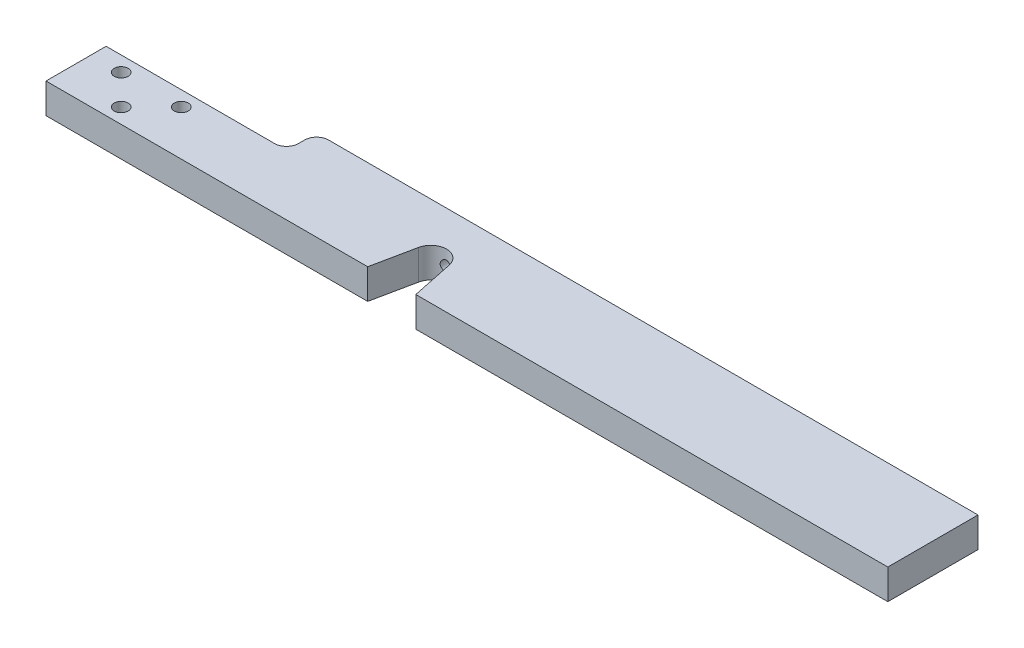
ISO-10303-21;
HEADER;
FILE_DESCRIPTION(('STEP AP214'),'2;1');
FILE_NAME('part.step','',(''),(''),'','','');
FILE_SCHEMA(('AUTOMOTIVE_DESIGN { 1 0 10303 214 1 1 1 1 }'));
ENDSEC;
DATA;
#1=APPLICATION_CONTEXT('core data for automotive mechanical design processes');
#2=APPLICATION_PROTOCOL_DEFINITION('international standard','automotive_design',2000,#1);
#3=PRODUCT_CONTEXT('',#1,'mechanical');
#4=PRODUCT('Part','Part','',(#3));
#5=PRODUCT_RELATED_PRODUCT_CATEGORY('part','',(#4));
#6=PRODUCT_DEFINITION_FORMATION('','',#4);
#7=PRODUCT_DEFINITION_CONTEXT('part definition',#1,'design');
#8=PRODUCT_DEFINITION('design','',#6,#7);
#9=PRODUCT_DEFINITION_SHAPE('','',#8);
#10=(LENGTH_UNIT() NAMED_UNIT(*) SI_UNIT(.MILLI.,.METRE.));
#11=(NAMED_UNIT(*) PLANE_ANGLE_UNIT() SI_UNIT($,.RADIAN.));
#12=(NAMED_UNIT(*) SI_UNIT($,.STERADIAN.) SOLID_ANGLE_UNIT());
#13=UNCERTAINTY_MEASURE_WITH_UNIT(LENGTH_MEASURE(1.E-05),#10,'distance_accuracy_value','');
#14=(GEOMETRIC_REPRESENTATION_CONTEXT(3) GLOBAL_UNCERTAINTY_ASSIGNED_CONTEXT((#13)) GLOBAL_UNIT_ASSIGNED_CONTEXT((#10,
#11,#12)) REPRESENTATION_CONTEXT('',''));
#15=CARTESIAN_POINT('',(0.,0.,0.));
#16=DIRECTION('',(0.,0.,1.));
#17=DIRECTION('',(1.,0.,0.));
#18=AXIS2_PLACEMENT_3D('',#15,#16,#17);
#19=CARTESIAN_POINT('',(0.,6.35,0.));
#20=DIRECTION('',(1.,0.,0.));
#21=DIRECTION('',(0.,0.,-1.));
#22=AXIS2_PLACEMENT_3D('',#19,#20,#21);
#23=PLANE('',#22);
#24=DIRECTION('',(0.,0.,1.));
#25=VECTOR('',#24,1.);
#26=CARTESIAN_POINT('',(0.,0.,0.));
#27=LINE('',#26,#25);
#28=CARTESIAN_POINT('',(0.,0.,-12.7));
#29=VERTEX_POINT('',#28);
#30=CARTESIAN_POINT('',(0.,0.,0.));
#31=VERTEX_POINT('',#30);
#32=EDGE_CURVE('E168',#29,#31,#27,.T.);
#33=ORIENTED_EDGE('',*,*,#32,.T.);
#34=DIRECTION('',(0.,-1.,0.));
#35=VECTOR('',#34,1.);
#36=CARTESIAN_POINT('',(0.,6.35,0.));
#37=LINE('',#36,#35);
#38=CARTESIAN_POINT('',(0.,6.35,0.));
#39=VERTEX_POINT('',#38);
#40=EDGE_CURVE('E11',#39,#31,#37,.T.);
#41=ORIENTED_EDGE('',*,*,#40,.F.);
#42=DIRECTION('',(0.,0.,1.));
#43=VECTOR('',#42,1.);
#44=CARTESIAN_POINT('',(0.,6.35,0.));
#45=LINE('',#44,#43);
#46=CARTESIAN_POINT('',(0.,6.35,-12.7));
#47=VERTEX_POINT('',#46);
#48=EDGE_CURVE('E203',#47,#39,#45,.T.);
#49=ORIENTED_EDGE('',*,*,#48,.F.);
#50=DIRECTION('',(0.,-1.,0.));
#51=VECTOR('',#50,1.);
#52=CARTESIAN_POINT('',(0.,6.35,-12.7));
#53=LINE('',#52,#51);
#54=EDGE_CURVE('E164',#47,#29,#53,.T.);
#55=ORIENTED_EDGE('',*,*,#54,.T.);
#56=EDGE_LOOP('',(#33,#41,#49,#55));
#57=FACE_BOUND('',#56,.T.);
#58=ADVANCED_FACE('F41',(#57),#23,.F.);
#59=CARTESIAN_POINT('',(0.,6.35,0.));
#60=DIRECTION('',(0.,0.,-1.));
#61=DIRECTION('',(-1.,0.,0.));
#62=AXIS2_PLACEMENT_3D('',#59,#60,#61);
#63=PLANE('',#62);
#64=DIRECTION('',(1.,0.,0.));
#65=VECTOR('',#64,1.);
#66=CARTESIAN_POINT('',(0.,0.,0.));
#67=LINE('',#66,#65);
#68=CARTESIAN_POINT('',(67.945,0.,0.));
#69=VERTEX_POINT('',#68);
#70=EDGE_CURVE('E172',#31,#69,#67,.T.);
#71=ORIENTED_EDGE('',*,*,#70,.T.);
#72=DIRECTION('',(0.,-1.,0.));
#73=VECTOR('',#72,1.);
#74=CARTESIAN_POINT('',(67.945,6.35,0.));
#75=LINE('',#74,#73);
#76=CARTESIAN_POINT('',(67.945,6.35,0.));
#77=VERTEX_POINT('',#76);
#78=EDGE_CURVE('E51',#77,#69,#75,.T.);
#79=ORIENTED_EDGE('',*,*,#78,.F.);
#80=DIRECTION('',(1.,0.,0.));
#81=VECTOR('',#80,1.);
#82=CARTESIAN_POINT('',(0.,6.35,0.));
#83=LINE('',#82,#81);
#84=EDGE_CURVE('E115',#39,#77,#83,.T.);
#85=ORIENTED_EDGE('',*,*,#84,.F.);
#86=ORIENTED_EDGE('',*,*,#40,.T.);
#87=EDGE_LOOP('',(#71,#79,#85,#86));
#88=FACE_BOUND('',#87,.T.);
#89=ADVANCED_FACE('F311',(#88),#63,.F.);
#90=CARTESIAN_POINT('',(67.945,6.35,0.));
#91=DIRECTION('',(-0.979257447594277,0.,-0.202619967750324));
#92=DIRECTION('',(-0.202619967750324,0.,0.979257447594277));
#93=AXIS2_PLACEMENT_3D('',#90,#91,#92);
#94=PLANE('',#93);
#95=DIRECTION('',(0.202619967750324,0.,-0.979257447594277));
#96=VECTOR('',#95,1.);
#97=CARTESIAN_POINT('',(67.945,0.,0.));
#98=LINE('',#97,#96);
#99=CARTESIAN_POINT('',(69.7914919080437,0.,-8.92405113351157));
#100=VERTEX_POINT('',#99);
#101=EDGE_CURVE('E176',#69,#100,#98,.T.);
#102=ORIENTED_EDGE('',*,*,#101,.T.);
#103=DIRECTION('',(0.,-1.,0.));
#104=VECTOR('',#103,1.);
#105=CARTESIAN_POINT('',(69.7914919080437,6.35,-8.92405113351157));
#106=LINE('',#105,#104);
#107=CARTESIAN_POINT('',(69.7914919080437,6.35,-8.92405113351157));
#108=VERTEX_POINT('',#107);
#109=EDGE_CURVE('E230',#108,#100,#106,.T.);
#110=ORIENTED_EDGE('',*,*,#109,.F.);
#111=DIRECTION('',(0.202619967750324,0.,-0.979257447594277));
#112=VECTOR('',#111,1.);
#113=CARTESIAN_POINT('',(67.945,6.35,0.));
#114=LINE('',#113,#112);
#115=EDGE_CURVE('E264',#77,#108,#114,.T.);
#116=ORIENTED_EDGE('',*,*,#115,.F.);
#117=ORIENTED_EDGE('',*,*,#78,.T.);
#118=EDGE_LOOP('',(#102,#110,#116,#117));
#119=FACE_BOUND('',#118,.T.);
#120=ADVANCED_FACE('F315',(#119),#94,.F.);
#121=CARTESIAN_POINT('',(73.025,6.35,-8.255));
#122=DIRECTION('',(0.,-1.,0.));
#123=DIRECTION('',(0.,0.,-1.));
#124=AXIS2_PLACEMENT_3D('',#121,#122,#123);
#125=CYLINDRICAL_SURFACE('',#124,3.302);
#126=CARTESIAN_POINT('',(71.8947,3.175,-11.3575192843881));
#127=CARTESIAN_POINT('',(71.8946993494637,3.23645830439946,-11.3575187615559));
#128=CARTESIAN_POINT('',(71.8997294498021,3.29791213405998,-11.3593653804656));
#129=CARTESIAN_POINT('',(71.9196443110023,3.41899240568933,-11.3665112756475));
#130=CARTESIAN_POINT('',(71.9345302575812,3.47861862688278,-11.3718109673437));
#131=CARTESIAN_POINT('',(71.9735672399483,3.59426866571021,-11.3851938901079));
#132=CARTESIAN_POINT('',(71.9976993083015,3.65029958580121,-11.3932714192856));
#133=CARTESIAN_POINT('',(72.0544781761868,3.75753667636533,-11.4112914087326));
#134=CARTESIAN_POINT('',(72.087127010396,3.80874168993232,-11.4212343144856));
#135=CARTESIAN_POINT('',(72.1614565992715,3.90698759099543,-11.442325061932));
#136=CARTESIAN_POINT('',(72.203430118254,3.95380034136833,-11.4535041050975));
#137=CARTESIAN_POINT('',(72.2945935509914,4.03987901575997,-11.475544536865));
#138=CARTESIAN_POINT('',(72.3437846937133,4.07914365190256,-11.4864058709911));
#139=CARTESIAN_POINT('',(72.4496683567572,4.15005964818104,-11.5069503332551));
#140=CARTESIAN_POINT('',(72.5065308546976,4.18147012981666,-11.5165925161337));
#141=CARTESIAN_POINT('',(72.6251196150618,4.23418872443438,-11.5332431198053));
#142=CARTESIAN_POINT('',(72.6868444844702,4.25549971862067,-11.5402522916311));
#143=CARTESIAN_POINT('',(72.8110124977507,4.28663534222334,-11.5506260320747));
#144=CARTESIAN_POINT('',(72.8733470047055,4.29685118756294,-11.5541144027929));
#145=CARTESIAN_POINT('',(72.9989365756179,4.30675242343217,-11.5574939524814));
#146=CARTESIAN_POINT('',(73.0621913849751,4.30644067304771,-11.5573861081123));
#147=CARTESIAN_POINT('',(73.1850497529945,4.2955395384988,-11.5536682211256));
#148=CARTESIAN_POINT('',(73.2446961640986,4.28537548661383,-11.5502031171494));
#149=CARTESIAN_POINT('',(73.3613789823123,4.25576412365447,-11.5403437014819));
#150=CARTESIAN_POINT('',(73.418415209944,4.23631617526108,-11.5339491886944));
#151=CARTESIAN_POINT('',(73.5291658617841,4.18845158603613,-11.5187692724412));
#152=CARTESIAN_POINT('',(73.5828250634082,4.15991744110105,-11.5099527649321));
#153=CARTESIAN_POINT('',(73.6847164151935,4.09478860163524,-11.4908413891362));
#154=CARTESIAN_POINT('',(73.7329469939191,4.05819158214614,-11.4805460947346));
#155=CARTESIAN_POINT('',(73.8251380621585,3.97585136969718,-11.4589562867013));
#156=CARTESIAN_POINT('',(73.8687691868438,3.92974522389131,-11.4476375373652));
#157=CARTESIAN_POINT('',(73.9477904802454,3.83077925403497,-11.4257014402563));
#158=CARTESIAN_POINT('',(73.9831792304712,3.77791826991554,-11.4150842134384));
#159=CARTESIAN_POINT('',(74.0452013182073,3.66584756589527,-11.3956162871904));
#160=CARTESIAN_POINT('',(74.0716879200902,3.60655093811828,-11.3867960569157));
#161=CARTESIAN_POINT('',(74.114185519756,3.4839603803734,-11.3722727264807));
#162=CARTESIAN_POINT('',(74.1302011970034,3.42066824988531,-11.3665682340825));
#163=CARTESIAN_POINT('',(74.150615688418,3.29508824596393,-11.3592400176494));
#164=CARTESIAN_POINT('',(74.155527894858,3.23289434894944,-11.3574361247854));
#165=CARTESIAN_POINT('',(74.1550559451683,3.10855796936782,-11.3576083312912));
#166=CARTESIAN_POINT('',(74.1496737925388,3.04641547915064,-11.3595836951376));
#167=CARTESIAN_POINT('',(74.1292281924608,2.92634011677743,-11.3669114952069));
#168=CARTESIAN_POINT('',(74.1145294382515,2.86833652823269,-11.3721365840675));
#169=CARTESIAN_POINT('',(74.076309821016,2.75563342652693,-11.3852327238393));
#170=CARTESIAN_POINT('',(74.052787341081,2.70093452106872,-11.3931042596727));
#171=CARTESIAN_POINT('',(73.996707278532,2.59439136566412,-11.4109276718971));
#172=CARTESIAN_POINT('',(73.9638771132714,2.54270092122503,-11.4209396358174));
#173=CARTESIAN_POINT('',(73.8904184820523,2.44537772787759,-11.4418025597471));
#174=CARTESIAN_POINT('',(73.8497875977339,2.39974686498663,-11.4526537793159));
#175=CARTESIAN_POINT('',(73.7594132487639,2.31342246205734,-11.4746442259645));
#176=CARTESIAN_POINT('',(73.7093098315759,2.27310113721342,-11.4857697698485));
#177=CARTESIAN_POINT('',(73.6027735815834,2.20141017492028,-11.506510805588));
#178=CARTESIAN_POINT('',(73.546340934877,2.17004027436884,-11.5161263418222));
#179=CARTESIAN_POINT('',(73.428989340434,2.11741847282589,-11.5327252442004));
#180=CARTESIAN_POINT('',(73.3681001714039,2.09610543207395,-11.53972446048));
#181=CARTESIAN_POINT('',(73.2433132015169,2.06411663682628,-11.5503690822293));
#182=CARTESIAN_POINT('',(73.1794165627102,2.05343680855257,-11.5540157720722));
#183=CARTESIAN_POINT('',(73.0538240338444,2.04339980327644,-11.557442301251));
#184=CARTESIAN_POINT('',(72.9921752649659,2.04350958129975,-11.5574041847473));
#185=CARTESIAN_POINT('',(72.8698153959934,2.05372215530308,-11.5539190529567));
#186=CARTESIAN_POINT('',(72.8091042131999,2.0638240647573,-11.5504723400887));
#187=CARTESIAN_POINT('',(72.6914065149566,2.09337521924194,-11.5406277560756));
#188=CARTESIAN_POINT('',(72.6343733899131,2.11265766651201,-11.5342826255523));
#189=CARTESIAN_POINT('',(72.5243329212001,2.15986599888481,-11.5192952613406));
#190=CARTESIAN_POINT('',(72.4713263199978,2.18779347328426,-11.5106526053177));
#191=CARTESIAN_POINT('',(72.3686356368359,2.25272348477241,-11.4915448587191));
#192=CARTESIAN_POINT('',(72.3191556030653,2.29003172783729,-11.4810227977689));
#193=CARTESIAN_POINT('',(72.2269859951878,2.3721524442738,-11.4594690893457));
#194=CARTESIAN_POINT('',(72.1842986556311,2.41696737716356,-11.4484372757164));
#195=CARTESIAN_POINT('',(72.1051025155197,2.5150725733856,-11.4265537565176));
#196=CARTESIAN_POINT('',(72.0689276341436,2.56863932199355,-11.4157289759165));
#197=CARTESIAN_POINT('',(72.0061118593961,2.6814318808714,-11.3960443457298));
#198=CARTESIAN_POINT('',(71.9794691317939,2.74065659962083,-11.3871841182387));
#199=CARTESIAN_POINT('',(71.9372167209409,2.86148896053737,-11.3727588342935));
#200=CARTESIAN_POINT('',(71.9213278972815,2.92298869840376,-11.3671110704097));
#201=CARTESIAN_POINT('',(71.9000719663457,3.04799442224821,-11.359492297099));
#202=CARTESIAN_POINT('',(71.894700672152,3.11149959964743,-11.3575198245926));
#203=CARTESIAN_POINT('',(71.8947,3.175,-11.3575192843881));
#204=B_SPLINE_CURVE_WITH_KNOTS('',3,(#126,#127,#128,#129,#130,#131,#132,#133,#134,#135,#136,
#137,#138,#139,#140,#141,#142,#143,#144,#145,#146,#147,#148,#149,#150,#151,#152,#153,#154,#155,
#156,#157,#158,#159,#160,#161,#162,#163,#164,#165,#166,#167,#168,#169,#170,#171,#172,#173,#174,
#175,#176,#177,#178,#179,#180,#181,#182,#183,#184,#185,#186,#187,#188,#189,#190,#191,#192,#193,
#194,#195,#196,#197,#198,#199,#200,#201,#202,#203),.UNSPECIFIED.,.T.,.F.,(4,2,2,2,2,2,2,2,2,2,2,
2,2,2,2,2,2,2,2,2,2,2,2,2,2,2,2,2,2,2,2,2,2,2,2,2,2,2,4),(0.,0.184139488870411,
0.368301134847036,0.552086998179326,0.735916808699115,0.926639670885485,1.11739504580711,
1.31343168230347,1.50941235931715,1.69823273161615,1.88700182446465,2.06796862987581,
2.24894786004546,2.43236969133489,2.61584448234337,2.8083975921362,3.00098381535716,
3.19660442775647,3.39213755728216,3.5784268790457,3.76467994865235,3.94405796872786,
4.12346887510208,4.30880130620777,4.49419128666842,4.68906948533348,4.88394195550574,
5.07761394652443,5.27121170968006,5.45525010586563,5.6392721751891,5.82007147427238,
6.00090403115215,6.18863895986319,6.37643551945199,6.57210260422142,6.7677320173542,
6.95806575682674,7.14832371103236),.UNSPECIFIED.);
#205=CARTESIAN_POINT('',(71.8947,3.175,-11.3575192843881));
#206=VERTEX_POINT('',#205);
#207=EDGE_CURVE('E436',#206,#206,#204,.T.);
#208=ORIENTED_EDGE('',*,*,#207,.T.);
#209=EDGE_LOOP('',(#208));
#210=FACE_BOUND('',#209,.T.);
#211=CARTESIAN_POINT('',(73.025,0.,-8.255));
#212=DIRECTION('',(0.,-1.,0.));
#213=DIRECTION('',(0.,0.,1.));
#214=AXIS2_PLACEMENT_3D('',#211,#212,#213);
#215=CIRCLE('',#214,3.302);
#216=CARTESIAN_POINT('',(76.2585080919563,0.,-8.92405113351157));
#217=VERTEX_POINT('',#216);
#218=EDGE_CURVE('E179',#100,#217,#215,.T.);
#219=ORIENTED_EDGE('',*,*,#218,.T.);
#220=DIRECTION('',(0.,-1.,0.));
#221=VECTOR('',#220,1.);
#222=CARTESIAN_POINT('',(76.2585080919563,6.35,-8.92405113351157));
#223=LINE('',#222,#221);
#224=CARTESIAN_POINT('',(76.2585080919563,6.35,-8.92405113351157));
#225=VERTEX_POINT('',#224);
#226=EDGE_CURVE('E226',#225,#217,#223,.T.);
#227=ORIENTED_EDGE('',*,*,#226,.F.);
#228=CARTESIAN_POINT('',(73.025,6.35,-8.255));
#229=DIRECTION('',(0.,-1.,0.));
#230=DIRECTION('',(0.,0.,1.));
#231=AXIS2_PLACEMENT_3D('',#228,#229,#230);
#232=CIRCLE('',#231,3.302);
#233=EDGE_CURVE('E267',#108,#225,#232,.T.);
#234=ORIENTED_EDGE('',*,*,#233,.F.);
#235=ORIENTED_EDGE('',*,*,#109,.T.);
#236=EDGE_LOOP('',(#219,#227,#234,#235));
#237=FACE_BOUND('',#236,.T.);
#238=ADVANCED_FACE('F319',(#210,#237),#125,.F.);
#239=CARTESIAN_POINT('',(78.105,6.35,0.));
#240=DIRECTION('',(0.979257447594277,0.,-0.202619967750324));
#241=DIRECTION('',(-0.202619967750324,0.,-0.979257447594277));
#242=AXIS2_PLACEMENT_3D('',#239,#240,#241);
#243=PLANE('',#242);
#244=DIRECTION('',(0.202619967750324,0.,0.979257447594277));
#245=VECTOR('',#244,1.);
#246=CARTESIAN_POINT('',(78.105,0.,0.));
#247=LINE('',#246,#245);
#248=CARTESIAN_POINT('',(78.105,0.,0.));
#249=VERTEX_POINT('',#248);
#250=EDGE_CURVE('E182',#217,#249,#247,.T.);
#251=ORIENTED_EDGE('',*,*,#250,.T.);
#252=DIRECTION('',(0.,-1.,0.));
#253=VECTOR('',#252,1.);
#254=CARTESIAN_POINT('',(78.105,6.35,0.));
#255=LINE('',#254,#253);
#256=CARTESIAN_POINT('',(78.105,6.35,0.));
#257=VERTEX_POINT('',#256);
#258=EDGE_CURVE('E222',#257,#249,#255,.T.);
#259=ORIENTED_EDGE('',*,*,#258,.F.);
#260=DIRECTION('',(0.202619967750324,0.,0.979257447594277));
#261=VECTOR('',#260,1.);
#262=CARTESIAN_POINT('',(78.105,6.35,0.));
#263=LINE('',#262,#261);
#264=EDGE_CURVE('E270',#225,#257,#263,.T.);
#265=ORIENTED_EDGE('',*,*,#264,.F.);
#266=ORIENTED_EDGE('',*,*,#226,.T.);
#267=EDGE_LOOP('',(#251,#259,#265,#266));
#268=FACE_BOUND('',#267,.T.);
#269=ADVANCED_FACE('F325',(#268),#243,.F.);
#270=CARTESIAN_POINT('',(78.105,6.35,0.));
#271=DIRECTION('',(0.,0.,-1.));
#272=DIRECTION('',(-1.,0.,0.));
#273=AXIS2_PLACEMENT_3D('',#270,#271,#272);
#274=PLANE('',#273);
#275=DIRECTION('',(1.,0.,0.));
#276=VECTOR('',#275,1.);
#277=CARTESIAN_POINT('',(78.105,0.,0.));
#278=LINE('',#277,#276);
#279=CARTESIAN_POINT('',(177.8,0.,0.));
#280=VERTEX_POINT('',#279);
#281=EDGE_CURVE('E185',#249,#280,#278,.T.);
#282=ORIENTED_EDGE('',*,*,#281,.T.);
#283=DIRECTION('',(0.,-1.,0.));
#284=VECTOR('',#283,1.);
#285=CARTESIAN_POINT('',(177.8,6.35,0.));
#286=LINE('',#285,#284);
#287=CARTESIAN_POINT('',(177.8,6.35,0.));
#288=VERTEX_POINT('',#287);
#289=EDGE_CURVE('E218',#288,#280,#286,.T.);
#290=ORIENTED_EDGE('',*,*,#289,.F.);
#291=DIRECTION('',(1.,0.,0.));
#292=VECTOR('',#291,1.);
#293=CARTESIAN_POINT('',(78.105,6.35,0.));
#294=LINE('',#293,#292);
#295=EDGE_CURVE('E273',#257,#288,#294,.T.);
#296=ORIENTED_EDGE('',*,*,#295,.F.);
#297=ORIENTED_EDGE('',*,*,#258,.T.);
#298=EDGE_LOOP('',(#282,#290,#296,#297));
#299=FACE_BOUND('',#298,.T.);
#300=ADVANCED_FACE('F329',(#299),#274,.F.);
#301=CARTESIAN_POINT('',(177.8,6.35,0.));
#302=DIRECTION('',(-1.,0.,0.));
#303=DIRECTION('',(0.,0.,1.));
#304=AXIS2_PLACEMENT_3D('',#301,#302,#303);
#305=PLANE('',#304);
#306=DIRECTION('',(0.,0.,-1.));
#307=VECTOR('',#306,1.);
#308=CARTESIAN_POINT('',(177.8,0.,0.));
#309=LINE('',#308,#307);
#310=CARTESIAN_POINT('',(177.8,0.,-19.05));
#311=VERTEX_POINT('',#310);
#312=EDGE_CURVE('E188',#280,#311,#309,.T.);
#313=ORIENTED_EDGE('',*,*,#312,.T.);
#314=DIRECTION('',(0.,-1.,0.));
#315=VECTOR('',#314,1.);
#316=CARTESIAN_POINT('',(177.8,6.35,-19.05));
#317=LINE('',#316,#315);
#318=CARTESIAN_POINT('',(177.8,6.35,-19.05));
#319=VERTEX_POINT('',#318);
#320=EDGE_CURVE('E214',#319,#311,#317,.T.);
#321=ORIENTED_EDGE('',*,*,#320,.F.);
#322=DIRECTION('',(0.,0.,-1.));
#323=VECTOR('',#322,1.);
#324=CARTESIAN_POINT('',(177.8,6.35,0.));
#325=LINE('',#324,#323);
#326=EDGE_CURVE('E276',#288,#319,#325,.T.);
#327=ORIENTED_EDGE('',*,*,#326,.F.);
#328=ORIENTED_EDGE('',*,*,#289,.T.);
#329=EDGE_LOOP('',(#313,#321,#327,#328));
#330=FACE_BOUND('',#329,.T.);
#331=ADVANCED_FACE('F333',(#330),#305,.F.);
#332=CARTESIAN_POINT('',(40.64,6.35,-19.05));
#333=DIRECTION('',(0.,0.,1.));
#334=DIRECTION('',(1.,0.,0.));
#335=AXIS2_PLACEMENT_3D('',#332,#333,#334);
#336=PLANE('',#335);
#337=CARTESIAN_POINT('',(73.025,3.175,-19.05));
#338=DIRECTION('',(0.,0.,-1.));
#339=DIRECTION('',(-1.,0.,0.));
#340=AXIS2_PLACEMENT_3D('',#337,#338,#339);
#341=CIRCLE('',#340,1.13029999999999);
#342=CARTESIAN_POINT('',(71.8947,3.175,-19.05));
#343=VERTEX_POINT('',#342);
#344=EDGE_CURVE('E443',#343,#343,#341,.T.);
#345=ORIENTED_EDGE('',*,*,#344,.F.);
#346=EDGE_LOOP('',(#345));
#347=FACE_BOUND('',#346,.T.);
#348=DIRECTION('',(-1.,0.,0.));
#349=VECTOR('',#348,1.);
#350=CARTESIAN_POINT('',(40.64,0.,-19.05));
#351=LINE('',#350,#349);
#352=CARTESIAN_POINT('',(40.64,0.,-19.05));
#353=VERTEX_POINT('',#352);
#354=EDGE_CURVE('E191',#311,#353,#351,.T.);
#355=ORIENTED_EDGE('',*,*,#354,.T.);
#356=DIRECTION('',(0.,-1.,0.));
#357=VECTOR('',#356,1.);
#358=CARTESIAN_POINT('',(40.64,6.35,-19.05));
#359=LINE('',#358,#357);
#360=CARTESIAN_POINT('',(40.64,6.35,-19.05));
#361=VERTEX_POINT('',#360);
#362=EDGE_CURVE('E210',#361,#353,#359,.T.);
#363=ORIENTED_EDGE('',*,*,#362,.F.);
#364=DIRECTION('',(-1.,0.,0.));
#365=VECTOR('',#364,1.);
#366=CARTESIAN_POINT('',(40.64,6.35,-19.05));
#367=LINE('',#366,#365);
#368=EDGE_CURVE('E279',#319,#361,#367,.T.);
#369=ORIENTED_EDGE('',*,*,#368,.F.);
#370=ORIENTED_EDGE('',*,*,#320,.T.);
#371=EDGE_LOOP('',(#355,#363,#369,#370));
#372=FACE_BOUND('',#371,.T.);
#373=ADVANCED_FACE('F287',(#347,#372),#336,.F.);
#374=CARTESIAN_POINT('',(40.64,6.35,-16.51));
#375=DIRECTION('',(0.,-1.,0.));
#376=DIRECTION('',(0.,0.,-1.));
#377=AXIS2_PLACEMENT_3D('',#374,#375,#376);
#378=CYLINDRICAL_SURFACE('',#377,2.54);
#379=CARTESIAN_POINT('',(40.64,0.,-16.51));
#380=DIRECTION('',(0.,1.,0.));
#381=DIRECTION('',(0.,0.,-1.));
#382=AXIS2_PLACEMENT_3D('',#379,#380,#381);
#383=CIRCLE('',#382,2.54);
#384=CARTESIAN_POINT('',(38.1,0.,-16.51));
#385=VERTEX_POINT('',#384);
#386=EDGE_CURVE('E194',#353,#385,#383,.T.);
#387=ORIENTED_EDGE('',*,*,#386,.T.);
#388=DIRECTION('',(0.,-1.,0.));
#389=VECTOR('',#388,1.);
#390=CARTESIAN_POINT('',(38.1,6.35,-16.51));
#391=LINE('',#390,#389);
#392=CARTESIAN_POINT('',(38.1,6.35,-16.51));
#393=VERTEX_POINT('',#392);
#394=EDGE_CURVE('E157',#393,#385,#391,.T.);
#395=ORIENTED_EDGE('',*,*,#394,.F.);
#396=CARTESIAN_POINT('',(40.64,6.35,-16.51));
#397=DIRECTION('',(0.,1.,0.));
#398=DIRECTION('',(0.,0.,-1.));
#399=AXIS2_PLACEMENT_3D('',#396,#397,#398);
#400=CIRCLE('',#399,2.54);
#401=EDGE_CURVE('E146',#361,#393,#400,.T.);
#402=ORIENTED_EDGE('',*,*,#401,.F.);
#403=ORIENTED_EDGE('',*,*,#362,.T.);
#404=EDGE_LOOP('',(#387,#395,#402,#403));
#405=FACE_BOUND('',#404,.T.);
#406=ADVANCED_FACE('F291',(#405),#378,.T.);
#407=CARTESIAN_POINT('',(38.1,6.35,-15.24));
#408=DIRECTION('',(1.,0.,0.));
#409=DIRECTION('',(0.,0.,-1.));
#410=AXIS2_PLACEMENT_3D('',#407,#408,#409);
#411=PLANE('',#410);
#412=DIRECTION('',(0.,0.,1.));
#413=VECTOR('',#412,1.);
#414=CARTESIAN_POINT('',(38.1,0.,-15.24));
#415=LINE('',#414,#413);
#416=CARTESIAN_POINT('',(38.1,0.,-15.24));
#417=VERTEX_POINT('',#416);
#418=EDGE_CURVE('E155',#385,#417,#415,.T.);
#419=ORIENTED_EDGE('',*,*,#418,.T.);
#420=DIRECTION('',(0.,-1.,0.));
#421=VECTOR('',#420,1.);
#422=CARTESIAN_POINT('',(38.1,6.35,-15.24));
#423=LINE('',#422,#421);
#424=CARTESIAN_POINT('',(38.1,6.35,-15.24));
#425=VERTEX_POINT('',#424);
#426=EDGE_CURVE('E152',#425,#417,#423,.T.);
#427=ORIENTED_EDGE('',*,*,#426,.F.);
#428=DIRECTION('',(0.,0.,1.));
#429=VECTOR('',#428,1.);
#430=CARTESIAN_POINT('',(38.1,6.35,-15.24));
#431=LINE('',#430,#429);
#432=EDGE_CURVE('E140',#393,#425,#431,.T.);
#433=ORIENTED_EDGE('',*,*,#432,.F.);
#434=ORIENTED_EDGE('',*,*,#394,.T.);
#435=EDGE_LOOP('',(#419,#427,#433,#434));
#436=FACE_BOUND('',#435,.T.);
#437=ADVANCED_FACE('F153',(#436),#411,.F.);
#438=CARTESIAN_POINT('',(35.56,6.35,-15.24));
#439=DIRECTION('',(0.,-1.,0.));
#440=DIRECTION('',(0.,0.,-1.));
#441=AXIS2_PLACEMENT_3D('',#438,#439,#440);
#442=CYLINDRICAL_SURFACE('',#441,2.54);
#443=CARTESIAN_POINT('',(35.56,0.,-15.24));
#444=DIRECTION('',(0.,-1.,0.));
#445=DIRECTION('',(0.,0.,-1.));
#446=AXIS2_PLACEMENT_3D('',#443,#444,#445);
#447=CIRCLE('',#446,2.54);
#448=CARTESIAN_POINT('',(35.56,0.,-12.7));
#449=VERTEX_POINT('',#448);
#450=EDGE_CURVE('E101',#417,#449,#447,.T.);
#451=ORIENTED_EDGE('',*,*,#450,.T.);
#452=DIRECTION('',(0.,-1.,0.));
#453=VECTOR('',#452,1.);
#454=CARTESIAN_POINT('',(35.56,6.35,-12.7));
#455=LINE('',#454,#453);
#456=CARTESIAN_POINT('',(35.56,6.35,-12.7));
#457=VERTEX_POINT('',#456);
#458=EDGE_CURVE('E158',#457,#449,#455,.T.);
#459=ORIENTED_EDGE('',*,*,#458,.F.);
#460=CARTESIAN_POINT('',(35.56,6.35,-15.24));
#461=DIRECTION('',(0.,-1.,0.));
#462=DIRECTION('',(0.,0.,-1.));
#463=AXIS2_PLACEMENT_3D('',#460,#461,#462);
#464=CIRCLE('',#463,2.54);
#465=EDGE_CURVE('E144',#425,#457,#464,.T.);
#466=ORIENTED_EDGE('',*,*,#465,.F.);
#467=ORIENTED_EDGE('',*,*,#426,.T.);
#468=EDGE_LOOP('',(#451,#459,#466,#467));
#469=FACE_BOUND('',#468,.T.);
#470=ADVANCED_FACE('F160',(#469),#442,.F.);
#471=CARTESIAN_POINT('',(0.,6.35,-12.7));
#472=DIRECTION('',(0.,0.,1.));
#473=DIRECTION('',(1.,0.,0.));
#474=AXIS2_PLACEMENT_3D('',#471,#472,#473);
#475=PLANE('',#474);
#476=DIRECTION('',(-1.,0.,0.));
#477=VECTOR('',#476,1.);
#478=CARTESIAN_POINT('',(0.,0.,-12.7));
#479=LINE('',#478,#477);
#480=EDGE_CURVE('E107',#449,#29,#479,.T.);
#481=ORIENTED_EDGE('',*,*,#480,.T.);
#482=ORIENTED_EDGE('',*,*,#54,.F.);
#483=DIRECTION('',(-1.,0.,0.));
#484=VECTOR('',#483,1.);
#485=CARTESIAN_POINT('',(0.,6.35,-12.7));
#486=LINE('',#485,#484);
#487=EDGE_CURVE('E60',#457,#47,#486,.T.);
#488=ORIENTED_EDGE('',*,*,#487,.F.);
#489=ORIENTED_EDGE('',*,*,#458,.T.);
#490=EDGE_LOOP('',(#481,#482,#488,#489));
#491=FACE_BOUND('',#490,.T.);
#492=ADVANCED_FACE('F299',(#491),#475,.F.);
#493=CARTESIAN_POINT('',(35.56,6.35,-15.24));
#494=DIRECTION('',(0.,-1.,0.));
#495=DIRECTION('',(0.,0.,-1.));
#496=AXIS2_PLACEMENT_3D('',#493,#494,#495);
#497=PLANE('',#496);
#498=CARTESIAN_POINT('',(6.35,6.35,-9.525));
#499=DIRECTION('',(0.,1.,0.));
#500=DIRECTION('',(0.,0.,1.));
#501=AXIS2_PLACEMENT_3D('',#498,#499,#500);
#502=CIRCLE('',#501,1.4732);
#503=CARTESIAN_POINT('',(6.35,6.35,-8.0518));
#504=VERTEX_POINT('',#503);
#505=EDGE_CURVE('E256',#504,#504,#502,.T.);
#506=ORIENTED_EDGE('',*,*,#505,.F.);
#507=EDGE_LOOP('',(#506));
#508=FACE_BOUND('',#507,.T.);
#509=CARTESIAN_POINT('',(19.05,6.35,-9.525));
#510=DIRECTION('',(0.,1.,0.));
#511=DIRECTION('',(0.,0.,1.));
#512=AXIS2_PLACEMENT_3D('',#509,#510,#511);
#513=CIRCLE('',#512,1.4732);
#514=CARTESIAN_POINT('',(19.05,6.35,-8.0518));
#515=VERTEX_POINT('',#514);
#516=EDGE_CURVE('E243',#515,#515,#513,.T.);
#517=ORIENTED_EDGE('',*,*,#516,.F.);
#518=EDGE_LOOP('',(#517));
#519=FACE_BOUND('',#518,.T.);
#520=CARTESIAN_POINT('',(12.7,6.35,-3.175));
#521=DIRECTION('',(0.,1.,0.));
#522=DIRECTION('',(0.,0.,1.));
#523=AXIS2_PLACEMENT_3D('',#520,#521,#522);
#524=CIRCLE('',#523,1.4732);
#525=CARTESIAN_POINT('',(12.7,6.35,-1.7018));
#526=VERTEX_POINT('',#525);
#527=EDGE_CURVE('E239',#526,#526,#524,.T.);
#528=ORIENTED_EDGE('',*,*,#527,.F.);
#529=EDGE_LOOP('',(#528));
#530=FACE_BOUND('',#529,.T.);
#531=ORIENTED_EDGE('',*,*,#48,.T.);
#532=ORIENTED_EDGE('',*,*,#84,.T.);
#533=ORIENTED_EDGE('',*,*,#115,.T.);
#534=ORIENTED_EDGE('',*,*,#233,.T.);
#535=ORIENTED_EDGE('',*,*,#264,.T.);
#536=ORIENTED_EDGE('',*,*,#295,.T.);
#537=ORIENTED_EDGE('',*,*,#326,.T.);
#538=ORIENTED_EDGE('',*,*,#368,.T.);
#539=ORIENTED_EDGE('',*,*,#401,.T.);
#540=ORIENTED_EDGE('',*,*,#432,.T.);
#541=ORIENTED_EDGE('',*,*,#465,.T.);
#542=ORIENTED_EDGE('',*,*,#487,.T.);
#543=EDGE_LOOP('',(#531,#532,#533,#534,#535,#536,#537,#538,#539,#540,#541,#542));
#544=FACE_BOUND('',#543,.T.);
#545=ADVANCED_FACE('F142',(#508,#519,#530,#544),#497,.F.);
#546=CARTESIAN_POINT('',(35.56,0.,-15.24));
#547=DIRECTION('',(0.,-1.,0.));
#548=DIRECTION('',(0.,0.,-1.));
#549=AXIS2_PLACEMENT_3D('',#546,#547,#548);
#550=PLANE('',#549);
#551=CARTESIAN_POINT('',(6.35,0.,-9.525));
#552=DIRECTION('',(0.,-1.,0.));
#553=DIRECTION('',(0.,0.,-1.));
#554=AXIS2_PLACEMENT_3D('',#551,#552,#553);
#555=CIRCLE('',#554,1.4732);
#556=CARTESIAN_POINT('',(6.35,0.,-10.9982));
#557=VERTEX_POINT('',#556);
#558=EDGE_CURVE('E44',#557,#557,#555,.T.);
#559=ORIENTED_EDGE('',*,*,#558,.F.);
#560=EDGE_LOOP('',(#559));
#561=FACE_BOUND('',#560,.T.);
#562=CARTESIAN_POINT('',(19.05,0.,-9.525));
#563=DIRECTION('',(0.,-1.,0.));
#564=DIRECTION('',(0.,0.,-1.));
#565=AXIS2_PLACEMENT_3D('',#562,#563,#564);
#566=CIRCLE('',#565,1.4732);
#567=CARTESIAN_POINT('',(19.05,0.,-10.9982));
#568=VERTEX_POINT('',#567);
#569=EDGE_CURVE('E240',#568,#568,#566,.T.);
#570=ORIENTED_EDGE('',*,*,#569,.F.);
#571=EDGE_LOOP('',(#570));
#572=FACE_BOUND('',#571,.T.);
#573=CARTESIAN_POINT('',(12.7,0.,-3.175));
#574=DIRECTION('',(0.,-1.,0.));
#575=DIRECTION('',(0.,0.,-1.));
#576=AXIS2_PLACEMENT_3D('',#573,#574,#575);
#577=CIRCLE('',#576,1.4732);
#578=CARTESIAN_POINT('',(12.7,0.,-4.6482));
#579=VERTEX_POINT('',#578);
#580=EDGE_CURVE('E173',#579,#579,#577,.T.);
#581=ORIENTED_EDGE('',*,*,#580,.F.);
#582=EDGE_LOOP('',(#581));
#583=FACE_BOUND('',#582,.T.);
#584=ORIENTED_EDGE('',*,*,#32,.F.);
#585=ORIENTED_EDGE('',*,*,#480,.F.);
#586=ORIENTED_EDGE('',*,*,#450,.F.);
#587=ORIENTED_EDGE('',*,*,#418,.F.);
#588=ORIENTED_EDGE('',*,*,#386,.F.);
#589=ORIENTED_EDGE('',*,*,#354,.F.);
#590=ORIENTED_EDGE('',*,*,#312,.F.);
#591=ORIENTED_EDGE('',*,*,#281,.F.);
#592=ORIENTED_EDGE('',*,*,#250,.F.);
#593=ORIENTED_EDGE('',*,*,#218,.F.);
#594=ORIENTED_EDGE('',*,*,#101,.F.);
#595=ORIENTED_EDGE('',*,*,#70,.F.);
#596=EDGE_LOOP('',(#584,#585,#586,#587,#588,#589,#590,#591,#592,#593,#594,#595));
#597=FACE_BOUND('',#596,.T.);
#598=ADVANCED_FACE('F294',(#561,#572,#583,#597),#550,.T.);
#599=CARTESIAN_POINT('',(12.7,6.35,-3.175));
#600=DIRECTION('',(0.,1.,0.));
#601=DIRECTION('',(0.,0.,1.));
#602=AXIS2_PLACEMENT_3D('',#599,#600,#601);
#603=CYLINDRICAL_SURFACE('',#602,1.4732);
#604=ORIENTED_EDGE('',*,*,#580,.T.);
#605=EDGE_LOOP('',(#604));
#606=FACE_BOUND('',#605,.T.);
#607=ORIENTED_EDGE('',*,*,#527,.T.);
#608=EDGE_LOOP('',(#607));
#609=FACE_BOUND('',#608,.T.);
#610=ADVANCED_FACE('F371',(#606,#609),#603,.F.);
#611=CARTESIAN_POINT('',(19.05,6.35,-9.525));
#612=DIRECTION('',(0.,1.,0.));
#613=DIRECTION('',(0.,0.,1.));
#614=AXIS2_PLACEMENT_3D('',#611,#612,#613);
#615=CYLINDRICAL_SURFACE('',#614,1.4732);
#616=ORIENTED_EDGE('',*,*,#569,.T.);
#617=EDGE_LOOP('',(#616));
#618=FACE_BOUND('',#617,.T.);
#619=ORIENTED_EDGE('',*,*,#516,.T.);
#620=EDGE_LOOP('',(#619));
#621=FACE_BOUND('',#620,.T.);
#622=ADVANCED_FACE('F380',(#618,#621),#615,.F.);
#623=CARTESIAN_POINT('',(6.35,6.35,-9.525));
#624=DIRECTION('',(0.,1.,0.));
#625=DIRECTION('',(0.,0.,1.));
#626=AXIS2_PLACEMENT_3D('',#623,#624,#625);
#627=CYLINDRICAL_SURFACE('',#626,1.4732);
#628=ORIENTED_EDGE('',*,*,#558,.T.);
#629=EDGE_LOOP('',(#628));
#630=FACE_BOUND('',#629,.T.);
#631=ORIENTED_EDGE('',*,*,#505,.T.);
#632=EDGE_LOOP('',(#631));
#633=FACE_BOUND('',#632,.T.);
#634=ADVANCED_FACE('F390',(#630,#633),#627,.F.);
#635=CARTESIAN_POINT('',(73.025,3.175,-19.05));
#636=DIRECTION('',(0.,0.,-1.));
#637=DIRECTION('',(-1.,0.,0.));
#638=AXIS2_PLACEMENT_3D('',#635,#636,#637);
#639=CYLINDRICAL_SURFACE('',#638,1.13029999999999);
#640=ORIENTED_EDGE('',*,*,#207,.F.);
#641=EDGE_LOOP('',(#640));
#642=FACE_BOUND('',#641,.T.);
#643=ORIENTED_EDGE('',*,*,#344,.T.);
#644=EDGE_LOOP('',(#643));
#645=FACE_BOUND('',#644,.T.);
#646=ADVANCED_FACE('F399',(#642,#645),#639,.F.);
#647=CLOSED_SHELL('',(#58,#89,#120,#238,#269,#300,#331,#373,#406,#437,#470,#492,#545,#598,#610,
#622,#634,#646));
#648=MANIFOLD_SOLID_BREP('B2',#647);
#649=ADVANCED_BREP_SHAPE_REPRESENTATION('',(#18,#648),#14);
#650=SHAPE_DEFINITION_REPRESENTATION(#9,#649);
ENDSEC;
END-ISO-10303-21;
